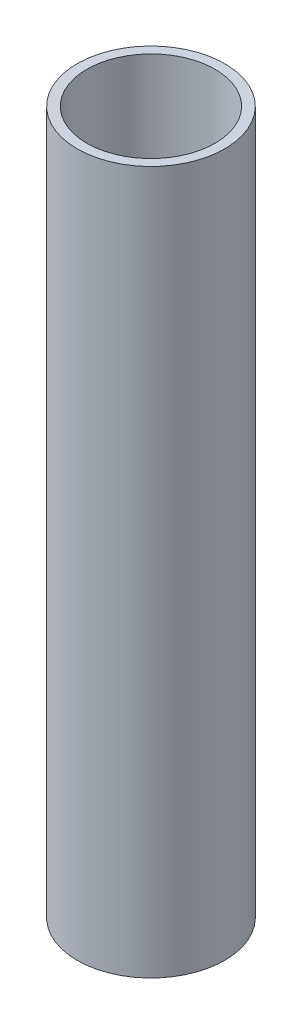
ISO-10303-21;
HEADER;
FILE_DESCRIPTION(('STEP AP214'),'2;1');
FILE_NAME('part.step','',(''),(''),'','','');
FILE_SCHEMA(('AUTOMOTIVE_DESIGN { 1 0 10303 214 1 1 1 1 }'));
ENDSEC;
DATA;
#1=APPLICATION_CONTEXT('core data for automotive mechanical design processes');
#2=APPLICATION_PROTOCOL_DEFINITION('international standard','automotive_design',2000,#1);
#3=PRODUCT_CONTEXT('',#1,'mechanical');
#4=PRODUCT('Part','Part','',(#3));
#5=PRODUCT_RELATED_PRODUCT_CATEGORY('part','',(#4));
#6=PRODUCT_DEFINITION_FORMATION('','',#4);
#7=PRODUCT_DEFINITION_CONTEXT('part definition',#1,'design');
#8=PRODUCT_DEFINITION('design','',#6,#7);
#9=PRODUCT_DEFINITION_SHAPE('','',#8);
#10=(LENGTH_UNIT() NAMED_UNIT(*) SI_UNIT(.MILLI.,.METRE.));
#11=(NAMED_UNIT(*) PLANE_ANGLE_UNIT() SI_UNIT($,.RADIAN.));
#12=(NAMED_UNIT(*) SI_UNIT($,.STERADIAN.) SOLID_ANGLE_UNIT());
#13=UNCERTAINTY_MEASURE_WITH_UNIT(LENGTH_MEASURE(1.E-05),#10,'distance_accuracy_value','');
#14=(GEOMETRIC_REPRESENTATION_CONTEXT(3) GLOBAL_UNCERTAINTY_ASSIGNED_CONTEXT((#13)) GLOBAL_UNIT_ASSIGNED_CONTEXT((#10,
#11,#12)) REPRESENTATION_CONTEXT('',''));
#15=CARTESIAN_POINT('',(0.,0.,0.));
#16=DIRECTION('',(0.,0.,1.));
#17=DIRECTION('',(1.,0.,0.));
#18=AXIS2_PLACEMENT_3D('',#15,#16,#17);
#19=CARTESIAN_POINT('',(0.,160.,0.));
#20=DIRECTION('',(0.,1.,0.));
#21=DIRECTION('',(0.,0.,1.));
#22=AXIS2_PLACEMENT_3D('',#19,#20,#21);
#23=PLANE('',#22);
#24=CARTESIAN_POINT('',(0.,160.,0.));
#25=DIRECTION('',(0.,1.,0.));
#26=DIRECTION('',(0.,0.,1.));
#27=AXIS2_PLACEMENT_3D('',#24,#25,#26);
#28=CIRCLE('',#27,16.8);
#29=CARTESIAN_POINT('',(0.,160.,16.8));
#30=VERTEX_POINT('',#29);
#31=EDGE_CURVE('E10',#30,#30,#28,.T.);
#32=ORIENTED_EDGE('',*,*,#31,.T.);
#33=EDGE_LOOP('',(#32));
#34=FACE_BOUND('',#33,.T.);
#35=CARTESIAN_POINT('',(0.,160.,0.));
#36=DIRECTION('',(0.,1.,0.));
#37=DIRECTION('',(0.,0.,1.));
#38=AXIS2_PLACEMENT_3D('',#35,#36,#37);
#39=CIRCLE('',#38,14.6);
#40=CARTESIAN_POINT('',(0.,160.,14.6));
#41=VERTEX_POINT('',#40);
#42=EDGE_CURVE('E52',#41,#41,#39,.T.);
#43=ORIENTED_EDGE('',*,*,#42,.F.);
#44=EDGE_LOOP('',(#43));
#45=FACE_BOUND('',#44,.T.);
#46=ADVANCED_FACE('F41',(#34,#45),#23,.T.);
#47=CARTESIAN_POINT('',(0.,0.,0.));
#48=DIRECTION('',(0.,1.,0.));
#49=DIRECTION('',(0.,0.,1.));
#50=AXIS2_PLACEMENT_3D('',#47,#48,#49);
#51=PLANE('',#50);
#52=CARTESIAN_POINT('',(0.,0.,0.));
#53=DIRECTION('',(0.,1.,0.));
#54=DIRECTION('',(0.,0.,1.));
#55=AXIS2_PLACEMENT_3D('',#52,#53,#54);
#56=CIRCLE('',#55,16.8);
#57=CARTESIAN_POINT('',(0.,0.,16.8));
#58=VERTEX_POINT('',#57);
#59=EDGE_CURVE('E45',#58,#58,#56,.T.);
#60=ORIENTED_EDGE('',*,*,#59,.F.);
#61=EDGE_LOOP('',(#60));
#62=FACE_BOUND('',#61,.T.);
#63=CARTESIAN_POINT('',(0.,0.,0.));
#64=DIRECTION('',(0.,1.,0.));
#65=DIRECTION('',(0.,0.,1.));
#66=AXIS2_PLACEMENT_3D('',#63,#64,#65);
#67=CIRCLE('',#66,14.6);
#68=CARTESIAN_POINT('',(0.,0.,14.6));
#69=VERTEX_POINT('',#68);
#70=EDGE_CURVE('E54',#69,#69,#67,.T.);
#71=ORIENTED_EDGE('',*,*,#70,.T.);
#72=EDGE_LOOP('',(#71));
#73=FACE_BOUND('',#72,.T.);
#74=ADVANCED_FACE('F64',(#62,#73),#51,.F.);
#75=CARTESIAN_POINT('',(0.,160.,0.));
#76=DIRECTION('',(0.,-1.,0.));
#77=DIRECTION('',(0.,0.,-1.));
#78=AXIS2_PLACEMENT_3D('',#75,#76,#77);
#79=CYLINDRICAL_SURFACE('',#78,16.8);
#80=ORIENTED_EDGE('',*,*,#31,.F.);
#81=EDGE_LOOP('',(#80));
#82=FACE_BOUND('',#81,.T.);
#83=ORIENTED_EDGE('',*,*,#59,.T.);
#84=EDGE_LOOP('',(#83));
#85=FACE_BOUND('',#84,.T.);
#86=ADVANCED_FACE('F43',(#82,#85),#79,.T.);
#87=CARTESIAN_POINT('',(0.,160.,0.));
#88=DIRECTION('',(0.,-1.,0.));
#89=DIRECTION('',(0.,0.,-1.));
#90=AXIS2_PLACEMENT_3D('',#87,#88,#89);
#91=CYLINDRICAL_SURFACE('',#90,14.6);
#92=ORIENTED_EDGE('',*,*,#42,.T.);
#93=EDGE_LOOP('',(#92));
#94=FACE_BOUND('',#93,.T.);
#95=ORIENTED_EDGE('',*,*,#70,.F.);
#96=EDGE_LOOP('',(#95));
#97=FACE_BOUND('',#96,.T.);
#98=ADVANCED_FACE('F60',(#94,#97),#91,.F.);
#99=CLOSED_SHELL('',(#46,#74,#86,#98));
#100=MANIFOLD_SOLID_BREP('B2',#99);
#101=ADVANCED_BREP_SHAPE_REPRESENTATION('',(#18,#100),#14);
#102=SHAPE_DEFINITION_REPRESENTATION(#9,#101);
ENDSEC;
END-ISO-10303-21;
